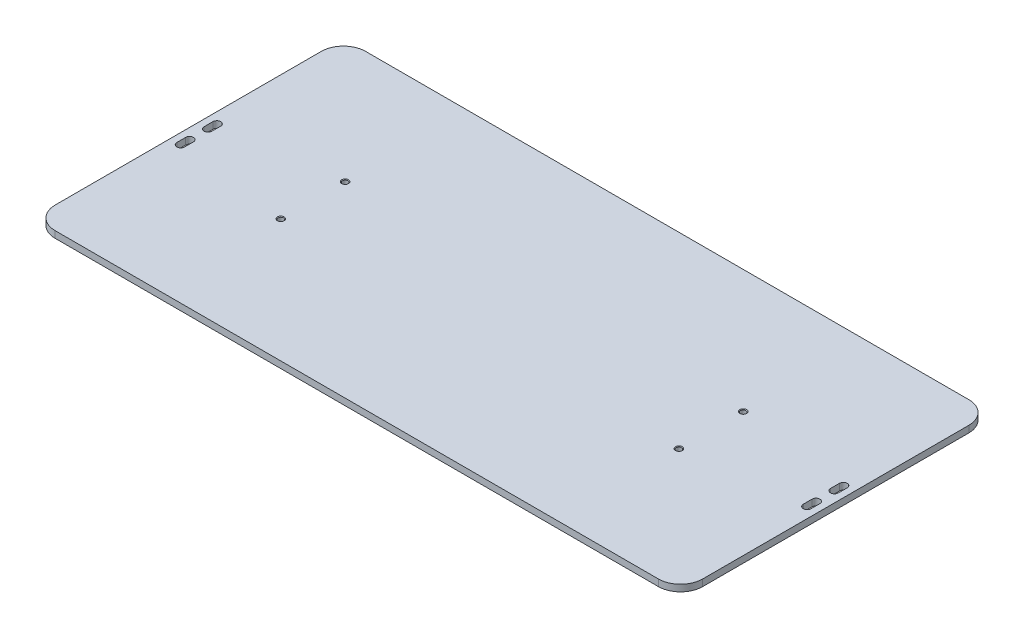
ISO-10303-21;
HEADER;
FILE_DESCRIPTION(('STEP AP214'),'2;1');
FILE_NAME('part.step','',(''),(''),'','','');
FILE_SCHEMA(('AUTOMOTIVE_DESIGN { 1 0 10303 214 1 1 1 1 }'));
ENDSEC;
DATA;
#1=APPLICATION_CONTEXT('core data for automotive mechanical design processes');
#2=APPLICATION_PROTOCOL_DEFINITION('international standard','automotive_design',2000,#1);
#3=PRODUCT_CONTEXT('',#1,'mechanical');
#4=PRODUCT('Part','Part','',(#3));
#5=PRODUCT_RELATED_PRODUCT_CATEGORY('part','',(#4));
#6=PRODUCT_DEFINITION_FORMATION('','',#4);
#7=PRODUCT_DEFINITION_CONTEXT('part definition',#1,'design');
#8=PRODUCT_DEFINITION('design','',#6,#7);
#9=PRODUCT_DEFINITION_SHAPE('','',#8);
#10=(LENGTH_UNIT() NAMED_UNIT(*) SI_UNIT(.MILLI.,.METRE.));
#11=(NAMED_UNIT(*) PLANE_ANGLE_UNIT() SI_UNIT($,.RADIAN.));
#12=(NAMED_UNIT(*) SI_UNIT($,.STERADIAN.) SOLID_ANGLE_UNIT());
#13=UNCERTAINTY_MEASURE_WITH_UNIT(LENGTH_MEASURE(1.E-05),#10,'distance_accuracy_value','');
#14=(GEOMETRIC_REPRESENTATION_CONTEXT(3) GLOBAL_UNCERTAINTY_ASSIGNED_CONTEXT((#13)) GLOBAL_UNIT_ASSIGNED_CONTEXT((#10,
#11,#12)) REPRESENTATION_CONTEXT('',''));
#15=CARTESIAN_POINT('',(0.,0.,0.));
#16=DIRECTION('',(0.,0.,1.));
#17=DIRECTION('',(1.,0.,0.));
#18=AXIS2_PLACEMENT_3D('',#15,#16,#17);
#19=CARTESIAN_POINT('',(0.,3.,0.));
#20=DIRECTION('',(0.,-1.,0.));
#21=DIRECTION('',(0.,0.,-1.));
#22=AXIS2_PLACEMENT_3D('',#19,#20,#21);
#23=PLANE('',#22);
#24=CARTESIAN_POINT('',(-89.7500000000001,3.,14.5));
#25=DIRECTION('',(0.,1.,0.));
#26=DIRECTION('',(0.,0.,1.));
#27=AXIS2_PLACEMENT_3D('',#24,#25,#26);
#28=CIRCLE('',#27,1.525);
#29=CARTESIAN_POINT('',(-89.7500000000001,3.,16.025));
#30=VERTEX_POINT('',#29);
#31=EDGE_CURVE('E839',#30,#30,#28,.T.);
#32=ORIENTED_EDGE('',*,*,#31,.F.);
#33=EDGE_LOOP('',(#32));
#34=FACE_BOUND('',#33,.T.);
#35=CARTESIAN_POINT('',(89.7500000000001,3.,14.5));
#36=DIRECTION('',(0.,1.,0.));
#37=DIRECTION('',(0.,0.,1.));
#38=AXIS2_PLACEMENT_3D('',#35,#36,#37);
#39=CIRCLE('',#38,1.525);
#40=CARTESIAN_POINT('',(89.7500000000001,3.,16.025));
#41=VERTEX_POINT('',#40);
#42=EDGE_CURVE('E830',#41,#41,#39,.T.);
#43=ORIENTED_EDGE('',*,*,#42,.F.);
#44=EDGE_LOOP('',(#43));
#45=FACE_BOUND('',#44,.T.);
#46=CARTESIAN_POINT('',(-89.7500000000001,3.,-14.5));
#47=DIRECTION('',(0.,1.,0.));
#48=DIRECTION('',(0.,0.,1.));
#49=AXIS2_PLACEMENT_3D('',#46,#47,#48);
#50=CIRCLE('',#49,1.525);
#51=CARTESIAN_POINT('',(-89.7500000000001,3.,-12.975));
#52=VERTEX_POINT('',#51);
#53=EDGE_CURVE('E810',#52,#52,#50,.T.);
#54=ORIENTED_EDGE('',*,*,#53,.F.);
#55=EDGE_LOOP('',(#54));
#56=FACE_BOUND('',#55,.T.);
#57=CARTESIAN_POINT('',(141.24,3.,-8.14));
#58=DIRECTION('',(0.,1.,0.));
#59=DIRECTION('',(0.,0.,-1.));
#60=AXIS2_PLACEMENT_3D('',#57,#58,#59);
#61=CIRCLE('',#60,1.76000000000001);
#62=CARTESIAN_POINT('',(143.,3.,-8.14));
#63=VERTEX_POINT('',#62);
#64=CARTESIAN_POINT('',(139.48,3.,-8.14));
#65=VERTEX_POINT('',#64);
#66=EDGE_CURVE('E247',#63,#65,#61,.T.);
#67=ORIENTED_EDGE('',*,*,#66,.F.);
#68=DIRECTION('',(0.,0.,-1.));
#69=VECTOR('',#68,1.);
#70=CARTESIAN_POINT('',(143.,3.,-8.14));
#71=LINE('',#70,#69);
#72=CARTESIAN_POINT('',(143.,3.,-4.16));
#73=VERTEX_POINT('',#72);
#74=EDGE_CURVE('E255',#73,#63,#71,.T.);
#75=ORIENTED_EDGE('',*,*,#74,.F.);
#76=CARTESIAN_POINT('',(141.24,3.,-4.16));
#77=DIRECTION('',(0.,1.,0.));
#78=DIRECTION('',(0.,0.,-1.));
#79=AXIS2_PLACEMENT_3D('',#76,#77,#78);
#80=CIRCLE('',#79,1.76000000000001);
#81=CARTESIAN_POINT('',(139.48,3.,-4.16));
#82=VERTEX_POINT('',#81);
#83=EDGE_CURVE('E252',#82,#73,#80,.T.);
#84=ORIENTED_EDGE('',*,*,#83,.F.);
#85=DIRECTION('',(0.,0.,1.));
#86=VECTOR('',#85,1.);
#87=CARTESIAN_POINT('',(139.48,3.,-8.14));
#88=LINE('',#87,#86);
#89=EDGE_CURVE('E249',#65,#82,#88,.T.);
#90=ORIENTED_EDGE('',*,*,#89,.F.);
#91=EDGE_LOOP('',(#67,#75,#84,#90));
#92=FACE_BOUND('',#91,.T.);
#93=CARTESIAN_POINT('',(-141.24,3.,-8.14));
#94=DIRECTION('',(0.,1.,0.));
#95=DIRECTION('',(0.,0.,1.));
#96=AXIS2_PLACEMENT_3D('',#93,#94,#95);
#97=CIRCLE('',#96,1.76000000000001);
#98=CARTESIAN_POINT('',(-139.48,3.,-8.14));
#99=VERTEX_POINT('',#98);
#100=CARTESIAN_POINT('',(-143.,3.,-8.14));
#101=VERTEX_POINT('',#100);
#102=EDGE_CURVE('E309',#99,#101,#97,.T.);
#103=ORIENTED_EDGE('',*,*,#102,.F.);
#104=DIRECTION('',(0.,0.,-1.));
#105=VECTOR('',#104,1.);
#106=CARTESIAN_POINT('',(-139.48,3.,-8.14));
#107=LINE('',#106,#105);
#108=CARTESIAN_POINT('',(-139.48,3.,-4.16));
#109=VERTEX_POINT('',#108);
#110=EDGE_CURVE('E317',#109,#99,#107,.T.);
#111=ORIENTED_EDGE('',*,*,#110,.F.);
#112=CARTESIAN_POINT('',(-141.24,3.,-4.16));
#113=DIRECTION('',(0.,1.,0.));
#114=DIRECTION('',(0.,0.,1.));
#115=AXIS2_PLACEMENT_3D('',#112,#113,#114);
#116=CIRCLE('',#115,1.76000000000001);
#117=CARTESIAN_POINT('',(-143.,3.,-4.16));
#118=VERTEX_POINT('',#117);
#119=EDGE_CURVE('E314',#118,#109,#116,.T.);
#120=ORIENTED_EDGE('',*,*,#119,.F.);
#121=DIRECTION('',(0.,0.,1.));
#122=VECTOR('',#121,1.);
#123=CARTESIAN_POINT('',(-143.,3.,-8.14));
#124=LINE('',#123,#122);
#125=EDGE_CURVE('E311',#101,#118,#124,.T.);
#126=ORIENTED_EDGE('',*,*,#125,.F.);
#127=EDGE_LOOP('',(#103,#111,#120,#126));
#128=FACE_BOUND('',#127,.T.);
#129=DIRECTION('',(1.,0.,0.));
#130=VECTOR('',#129,1.);
#131=CARTESIAN_POINT('',(-146.,3.,70.));
#132=LINE('',#131,#130);
#133=CARTESIAN_POINT('',(-136.,3.,70.));
#134=VERTEX_POINT('',#133);
#135=CARTESIAN_POINT('',(136.,3.,70.));
#136=VERTEX_POINT('',#135);
#137=EDGE_CURVE('E348',#134,#136,#132,.T.);
#138=ORIENTED_EDGE('',*,*,#137,.T.);
#139=CARTESIAN_POINT('',(136.,3.,60.));
#140=DIRECTION('',(0.,-1.,0.));
#141=DIRECTION('',(0.,0.,-1.));
#142=AXIS2_PLACEMENT_3D('',#139,#140,#141);
#143=CIRCLE('',#142,10.);
#144=CARTESIAN_POINT('',(146.,3.,60.));
#145=VERTEX_POINT('',#144);
#146=EDGE_CURVE('E383',#136,#145,#143,.F.);
#147=ORIENTED_EDGE('',*,*,#146,.T.);
#148=DIRECTION('',(0.,0.,-1.));
#149=VECTOR('',#148,1.);
#150=CARTESIAN_POINT('',(146.,3.,70.));
#151=LINE('',#150,#149);
#152=CARTESIAN_POINT('',(146.,3.,-60.));
#153=VERTEX_POINT('',#152);
#154=EDGE_CURVE('E340',#145,#153,#151,.T.);
#155=ORIENTED_EDGE('',*,*,#154,.T.);
#156=CARTESIAN_POINT('',(136.,3.,-60.));
#157=DIRECTION('',(0.,-1.,0.));
#158=DIRECTION('',(0.,0.,-1.));
#159=AXIS2_PLACEMENT_3D('',#156,#157,#158);
#160=CIRCLE('',#159,10.);
#161=CARTESIAN_POINT('',(136.,3.,-70.));
#162=VERTEX_POINT('',#161);
#163=EDGE_CURVE('E379',#153,#162,#160,.F.);
#164=ORIENTED_EDGE('',*,*,#163,.T.);
#165=DIRECTION('',(-1.,0.,0.));
#166=VECTOR('',#165,1.);
#167=CARTESIAN_POINT('',(-146.,3.,-70.));
#168=LINE('',#167,#166);
#169=CARTESIAN_POINT('',(-136.,3.,-70.));
#170=VERTEX_POINT('',#169);
#171=EDGE_CURVE('E343',#162,#170,#168,.T.);
#172=ORIENTED_EDGE('',*,*,#171,.T.);
#173=CARTESIAN_POINT('',(-136.,3.,-60.));
#174=DIRECTION('',(0.,-1.,0.));
#175=DIRECTION('',(0.,0.,-1.));
#176=AXIS2_PLACEMENT_3D('',#173,#174,#175);
#177=CIRCLE('',#176,10.);
#178=CARTESIAN_POINT('',(-146.,3.,-60.));
#179=VERTEX_POINT('',#178);
#180=EDGE_CURVE('E61',#170,#179,#177,.F.);
#181=ORIENTED_EDGE('',*,*,#180,.T.);
#182=DIRECTION('',(0.,0.,1.));
#183=VECTOR('',#182,1.);
#184=CARTESIAN_POINT('',(-146.,3.,70.));
#185=LINE('',#184,#183);
#186=CARTESIAN_POINT('',(-146.,3.,60.));
#187=VERTEX_POINT('',#186);
#188=EDGE_CURVE('E346',#179,#187,#185,.T.);
#189=ORIENTED_EDGE('',*,*,#188,.T.);
#190=CARTESIAN_POINT('',(-136.,3.,60.));
#191=DIRECTION('',(0.,-1.,0.));
#192=DIRECTION('',(0.,0.,-1.));
#193=AXIS2_PLACEMENT_3D('',#190,#191,#192);
#194=CIRCLE('',#193,10.);
#195=EDGE_CURVE('E381',#187,#134,#194,.F.);
#196=ORIENTED_EDGE('',*,*,#195,.T.);
#197=EDGE_LOOP('',(#138,#147,#155,#164,#172,#181,#189,#196));
#198=FACE_BOUND('',#197,.T.);
#199=CARTESIAN_POINT('',(-141.24,3.,8.14));
#200=DIRECTION('',(0.,1.,0.));
#201=DIRECTION('',(0.,0.,-1.));
#202=AXIS2_PLACEMENT_3D('',#199,#200,#201);
#203=CIRCLE('',#202,1.76000000000001);
#204=CARTESIAN_POINT('',(-143.,3.,8.14));
#205=VERTEX_POINT('',#204);
#206=CARTESIAN_POINT('',(-139.48,3.,8.14));
#207=VERTEX_POINT('',#206);
#208=EDGE_CURVE('E278',#205,#207,#203,.T.);
#209=ORIENTED_EDGE('',*,*,#208,.F.);
#210=DIRECTION('',(0.,0.,1.));
#211=VECTOR('',#210,1.);
#212=CARTESIAN_POINT('',(-143.,3.,8.14));
#213=LINE('',#212,#211);
#214=CARTESIAN_POINT('',(-143.,3.,4.16));
#215=VERTEX_POINT('',#214);
#216=EDGE_CURVE('E286',#215,#205,#213,.T.);
#217=ORIENTED_EDGE('',*,*,#216,.F.);
#218=CARTESIAN_POINT('',(-141.24,3.,4.16));
#219=DIRECTION('',(0.,1.,0.));
#220=DIRECTION('',(0.,0.,-1.));
#221=AXIS2_PLACEMENT_3D('',#218,#219,#220);
#222=CIRCLE('',#221,1.76000000000001);
#223=CARTESIAN_POINT('',(-139.48,3.,4.16));
#224=VERTEX_POINT('',#223);
#225=EDGE_CURVE('E283',#224,#215,#222,.T.);
#226=ORIENTED_EDGE('',*,*,#225,.F.);
#227=DIRECTION('',(0.,0.,-1.));
#228=VECTOR('',#227,1.);
#229=CARTESIAN_POINT('',(-139.48,3.,8.14));
#230=LINE('',#229,#228);
#231=EDGE_CURVE('E280',#207,#224,#230,.T.);
#232=ORIENTED_EDGE('',*,*,#231,.F.);
#233=EDGE_LOOP('',(#209,#217,#226,#232));
#234=FACE_BOUND('',#233,.T.);
#235=CARTESIAN_POINT('',(141.24,3.,8.14));
#236=DIRECTION('',(0.,1.,0.));
#237=DIRECTION('',(0.,0.,1.));
#238=AXIS2_PLACEMENT_3D('',#235,#236,#237);
#239=CIRCLE('',#238,1.76000000000001);
#240=CARTESIAN_POINT('',(139.48,3.,8.14));
#241=VERTEX_POINT('',#240);
#242=CARTESIAN_POINT('',(143.,3.,8.14));
#243=VERTEX_POINT('',#242);
#244=EDGE_CURVE('E203',#241,#243,#239,.T.);
#245=ORIENTED_EDGE('',*,*,#244,.F.);
#246=DIRECTION('',(0.,0.,1.));
#247=VECTOR('',#246,1.);
#248=CARTESIAN_POINT('',(139.48,3.,8.14));
#249=LINE('',#248,#247);
#250=CARTESIAN_POINT('',(139.48,3.,4.16));
#251=VERTEX_POINT('',#250);
#252=EDGE_CURVE('E229',#251,#241,#249,.T.);
#253=ORIENTED_EDGE('',*,*,#252,.F.);
#254=CARTESIAN_POINT('',(141.24,3.,4.16));
#255=DIRECTION('',(0.,1.,0.));
#256=DIRECTION('',(0.,0.,1.));
#257=AXIS2_PLACEMENT_3D('',#254,#255,#256);
#258=CIRCLE('',#257,1.76000000000001);
#259=CARTESIAN_POINT('',(143.,3.,4.16));
#260=VERTEX_POINT('',#259);
#261=EDGE_CURVE('E227',#260,#251,#258,.T.);
#262=ORIENTED_EDGE('',*,*,#261,.F.);
#263=DIRECTION('',(0.,0.,-1.));
#264=VECTOR('',#263,1.);
#265=CARTESIAN_POINT('',(143.,3.,8.14));
#266=LINE('',#265,#264);
#267=EDGE_CURVE('E213',#243,#260,#266,.T.);
#268=ORIENTED_EDGE('',*,*,#267,.F.);
#269=EDGE_LOOP('',(#245,#253,#262,#268));
#270=FACE_BOUND('',#269,.T.);
#271=CARTESIAN_POINT('',(89.7500000000001,3.,-14.5));
#272=DIRECTION('',(0.,1.,0.));
#273=DIRECTION('',(0.,0.,1.));
#274=AXIS2_PLACEMENT_3D('',#271,#272,#273);
#275=CIRCLE('',#274,1.525);
#276=CARTESIAN_POINT('',(89.7500000000001,3.,-12.975));
#277=VERTEX_POINT('',#276);
#278=EDGE_CURVE('E821',#277,#277,#275,.T.);
#279=ORIENTED_EDGE('',*,*,#278,.F.);
#280=EDGE_LOOP('',(#279));
#281=FACE_BOUND('',#280,.T.);
#282=ADVANCED_FACE('F39',(#34,#45,#56,#92,#128,#198,#234,#270,#281),#23,.F.);
#283=CARTESIAN_POINT('',(0.,0.,0.));
#284=DIRECTION('',(0.,-1.,0.));
#285=DIRECTION('',(0.,0.,-1.));
#286=AXIS2_PLACEMENT_3D('',#283,#284,#285);
#287=PLANE('',#286);
#288=CARTESIAN_POINT('',(-89.7500000000001,0.,14.5));
#289=DIRECTION('',(0.,1.,0.));
#290=DIRECTION('',(0.,0.,1.));
#291=AXIS2_PLACEMENT_3D('',#288,#289,#290);
#292=CIRCLE('',#291,1.25);
#293=CARTESIAN_POINT('',(-89.7500000000001,0.,15.75));
#294=VERTEX_POINT('',#293);
#295=EDGE_CURVE('E833',#294,#294,#292,.T.);
#296=ORIENTED_EDGE('',*,*,#295,.T.);
#297=EDGE_LOOP('',(#296));
#298=FACE_BOUND('',#297,.T.);
#299=CARTESIAN_POINT('',(89.7500000000001,0.,14.5));
#300=DIRECTION('',(0.,1.,0.));
#301=DIRECTION('',(0.,0.,1.));
#302=AXIS2_PLACEMENT_3D('',#299,#300,#301);
#303=CIRCLE('',#302,1.25);
#304=CARTESIAN_POINT('',(89.7500000000001,0.,15.75));
#305=VERTEX_POINT('',#304);
#306=EDGE_CURVE('E824',#305,#305,#303,.T.);
#307=ORIENTED_EDGE('',*,*,#306,.T.);
#308=EDGE_LOOP('',(#307));
#309=FACE_BOUND('',#308,.T.);
#310=CARTESIAN_POINT('',(89.7500000000001,0.,-14.5));
#311=DIRECTION('',(0.,1.,0.));
#312=DIRECTION('',(0.,0.,1.));
#313=AXIS2_PLACEMENT_3D('',#310,#311,#312);
#314=CIRCLE('',#313,1.25);
#315=CARTESIAN_POINT('',(89.7500000000001,0.,-13.25));
#316=VERTEX_POINT('',#315);
#317=EDGE_CURVE('E813',#316,#316,#314,.T.);
#318=ORIENTED_EDGE('',*,*,#317,.T.);
#319=EDGE_LOOP('',(#318));
#320=FACE_BOUND('',#319,.T.);
#321=DIRECTION('',(0.,0.,1.));
#322=VECTOR('',#321,1.);
#323=CARTESIAN_POINT('',(139.48,0.,8.14));
#324=LINE('',#323,#322);
#325=CARTESIAN_POINT('',(139.48,0.,4.16));
#326=VERTEX_POINT('',#325);
#327=CARTESIAN_POINT('',(139.48,0.,8.14));
#328=VERTEX_POINT('',#327);
#329=EDGE_CURVE('E214',#326,#328,#324,.T.);
#330=ORIENTED_EDGE('',*,*,#329,.T.);
#331=CARTESIAN_POINT('',(141.24,0.,8.14));
#332=DIRECTION('',(0.,1.,0.));
#333=DIRECTION('',(0.,0.,1.));
#334=AXIS2_PLACEMENT_3D('',#331,#332,#333);
#335=CIRCLE('',#334,1.76000000000001);
#336=CARTESIAN_POINT('',(143.,0.,8.14));
#337=VERTEX_POINT('',#336);
#338=EDGE_CURVE('E234',#328,#337,#335,.T.);
#339=ORIENTED_EDGE('',*,*,#338,.T.);
#340=DIRECTION('',(0.,0.,-1.));
#341=VECTOR('',#340,1.);
#342=CARTESIAN_POINT('',(143.,0.,8.14));
#343=LINE('',#342,#341);
#344=CARTESIAN_POINT('',(143.,0.,4.16));
#345=VERTEX_POINT('',#344);
#346=EDGE_CURVE('E220',#337,#345,#343,.T.);
#347=ORIENTED_EDGE('',*,*,#346,.T.);
#348=CARTESIAN_POINT('',(141.24,0.,4.16));
#349=DIRECTION('',(0.,1.,0.));
#350=DIRECTION('',(0.,0.,1.));
#351=AXIS2_PLACEMENT_3D('',#348,#349,#350);
#352=CIRCLE('',#351,1.76000000000001);
#353=EDGE_CURVE('E238',#345,#326,#352,.T.);
#354=ORIENTED_EDGE('',*,*,#353,.T.);
#355=EDGE_LOOP('',(#330,#339,#347,#354));
#356=FACE_BOUND('',#355,.T.);
#357=DIRECTION('',(0.,0.,-1.));
#358=VECTOR('',#357,1.);
#359=CARTESIAN_POINT('',(143.,0.,-8.14));
#360=LINE('',#359,#358);
#361=CARTESIAN_POINT('',(143.,0.,-4.16));
#362=VERTEX_POINT('',#361);
#363=CARTESIAN_POINT('',(143.,0.,-8.14));
#364=VERTEX_POINT('',#363);
#365=EDGE_CURVE('E250',#362,#364,#360,.T.);
#366=ORIENTED_EDGE('',*,*,#365,.T.);
#367=CARTESIAN_POINT('',(141.24,0.,-8.14));
#368=DIRECTION('',(0.,1.,0.));
#369=DIRECTION('',(0.,0.,-1.));
#370=AXIS2_PLACEMENT_3D('',#367,#368,#369);
#371=CIRCLE('',#370,1.76000000000001);
#372=CARTESIAN_POINT('',(139.48,0.,-8.14));
#373=VERTEX_POINT('',#372);
#374=EDGE_CURVE('E221',#364,#373,#371,.T.);
#375=ORIENTED_EDGE('',*,*,#374,.T.);
#376=DIRECTION('',(0.,0.,1.));
#377=VECTOR('',#376,1.);
#378=CARTESIAN_POINT('',(139.48,0.,-8.14));
#379=LINE('',#378,#377);
#380=CARTESIAN_POINT('',(139.48,0.,-4.16));
#381=VERTEX_POINT('',#380);
#382=EDGE_CURVE('E260',#373,#381,#379,.T.);
#383=ORIENTED_EDGE('',*,*,#382,.T.);
#384=CARTESIAN_POINT('',(141.24,0.,-4.16));
#385=DIRECTION('',(0.,1.,0.));
#386=DIRECTION('',(0.,0.,-1.));
#387=AXIS2_PLACEMENT_3D('',#384,#385,#386);
#388=CIRCLE('',#387,1.76000000000001);
#389=EDGE_CURVE('E263',#381,#362,#388,.T.);
#390=ORIENTED_EDGE('',*,*,#389,.T.);
#391=EDGE_LOOP('',(#366,#375,#383,#390));
#392=FACE_BOUND('',#391,.T.);
#393=DIRECTION('',(0.,0.,1.));
#394=VECTOR('',#393,1.);
#395=CARTESIAN_POINT('',(-143.,0.,8.14));
#396=LINE('',#395,#394);
#397=CARTESIAN_POINT('',(-143.,0.,4.16));
#398=VERTEX_POINT('',#397);
#399=CARTESIAN_POINT('',(-143.,0.,8.14));
#400=VERTEX_POINT('',#399);
#401=EDGE_CURVE('E281',#398,#400,#396,.T.);
#402=ORIENTED_EDGE('',*,*,#401,.T.);
#403=CARTESIAN_POINT('',(-141.24,0.,8.14));
#404=DIRECTION('',(0.,1.,0.));
#405=DIRECTION('',(0.,0.,-1.));
#406=AXIS2_PLACEMENT_3D('',#403,#404,#405);
#407=CIRCLE('',#406,1.76000000000001);
#408=CARTESIAN_POINT('',(-139.48,0.,8.14));
#409=VERTEX_POINT('',#408);
#410=EDGE_CURVE('E277',#400,#409,#407,.T.);
#411=ORIENTED_EDGE('',*,*,#410,.T.);
#412=DIRECTION('',(0.,0.,-1.));
#413=VECTOR('',#412,1.);
#414=CARTESIAN_POINT('',(-139.48,0.,8.14));
#415=LINE('',#414,#413);
#416=CARTESIAN_POINT('',(-139.48,0.,4.16));
#417=VERTEX_POINT('',#416);
#418=EDGE_CURVE('E291',#409,#417,#415,.T.);
#419=ORIENTED_EDGE('',*,*,#418,.T.);
#420=CARTESIAN_POINT('',(-141.24,0.,4.16));
#421=DIRECTION('',(0.,1.,0.));
#422=DIRECTION('',(0.,0.,-1.));
#423=AXIS2_PLACEMENT_3D('',#420,#421,#422);
#424=CIRCLE('',#423,1.76000000000001);
#425=EDGE_CURVE('E294',#417,#398,#424,.T.);
#426=ORIENTED_EDGE('',*,*,#425,.T.);
#427=EDGE_LOOP('',(#402,#411,#419,#426));
#428=FACE_BOUND('',#427,.T.);
#429=DIRECTION('',(0.,0.,-1.));
#430=VECTOR('',#429,1.);
#431=CARTESIAN_POINT('',(-139.48,0.,-8.14));
#432=LINE('',#431,#430);
#433=CARTESIAN_POINT('',(-139.48,0.,-4.16));
#434=VERTEX_POINT('',#433);
#435=CARTESIAN_POINT('',(-139.48,0.,-8.14));
#436=VERTEX_POINT('',#435);
#437=EDGE_CURVE('E312',#434,#436,#432,.T.);
#438=ORIENTED_EDGE('',*,*,#437,.T.);
#439=CARTESIAN_POINT('',(-141.24,0.,-8.14));
#440=DIRECTION('',(0.,1.,0.));
#441=DIRECTION('',(0.,0.,1.));
#442=AXIS2_PLACEMENT_3D('',#439,#440,#441);
#443=CIRCLE('',#442,1.76000000000001);
#444=CARTESIAN_POINT('',(-143.,0.,-8.14));
#445=VERTEX_POINT('',#444);
#446=EDGE_CURVE('E308',#436,#445,#443,.T.);
#447=ORIENTED_EDGE('',*,*,#446,.T.);
#448=DIRECTION('',(0.,0.,1.));
#449=VECTOR('',#448,1.);
#450=CARTESIAN_POINT('',(-143.,0.,-8.14));
#451=LINE('',#450,#449);
#452=CARTESIAN_POINT('',(-143.,0.,-4.16));
#453=VERTEX_POINT('',#452);
#454=EDGE_CURVE('E322',#445,#453,#451,.T.);
#455=ORIENTED_EDGE('',*,*,#454,.T.);
#456=CARTESIAN_POINT('',(-141.24,0.,-4.16));
#457=DIRECTION('',(0.,1.,0.));
#458=DIRECTION('',(0.,0.,1.));
#459=AXIS2_PLACEMENT_3D('',#456,#457,#458);
#460=CIRCLE('',#459,1.76000000000001);
#461=EDGE_CURVE('E325',#453,#434,#460,.T.);
#462=ORIENTED_EDGE('',*,*,#461,.T.);
#463=EDGE_LOOP('',(#438,#447,#455,#462));
#464=FACE_BOUND('',#463,.T.);
#465=DIRECTION('',(0.,0.,-1.));
#466=VECTOR('',#465,1.);
#467=CARTESIAN_POINT('',(146.,0.,70.));
#468=LINE('',#467,#466);
#469=CARTESIAN_POINT('',(146.,0.,60.));
#470=VERTEX_POINT('',#469);
#471=CARTESIAN_POINT('',(146.,0.,-60.));
#472=VERTEX_POINT('',#471);
#473=EDGE_CURVE('E339',#470,#472,#468,.T.);
#474=ORIENTED_EDGE('',*,*,#473,.F.);
#475=CARTESIAN_POINT('',(136.,0.,60.));
#476=DIRECTION('',(0.,-1.,0.));
#477=DIRECTION('',(0.,0.,-1.));
#478=AXIS2_PLACEMENT_3D('',#475,#476,#477);
#479=CIRCLE('',#478,10.);
#480=CARTESIAN_POINT('',(136.,0.,70.));
#481=VERTEX_POINT('',#480);
#482=EDGE_CURVE('E371',#470,#481,#479,.T.);
#483=ORIENTED_EDGE('',*,*,#482,.T.);
#484=DIRECTION('',(1.,0.,0.));
#485=VECTOR('',#484,1.);
#486=CARTESIAN_POINT('',(-146.,0.,70.));
#487=LINE('',#486,#485);
#488=CARTESIAN_POINT('',(-136.,0.,70.));
#489=VERTEX_POINT('',#488);
#490=EDGE_CURVE('E344',#489,#481,#487,.T.);
#491=ORIENTED_EDGE('',*,*,#490,.F.);
#492=CARTESIAN_POINT('',(-136.,0.,60.));
#493=DIRECTION('',(0.,-1.,0.));
#494=DIRECTION('',(0.,0.,-1.));
#495=AXIS2_PLACEMENT_3D('',#492,#493,#494);
#496=CIRCLE('',#495,10.);
#497=CARTESIAN_POINT('',(-146.,0.,60.));
#498=VERTEX_POINT('',#497);
#499=EDGE_CURVE('E369',#489,#498,#496,.T.);
#500=ORIENTED_EDGE('',*,*,#499,.T.);
#501=DIRECTION('',(0.,0.,1.));
#502=VECTOR('',#501,1.);
#503=CARTESIAN_POINT('',(-146.,0.,70.));
#504=LINE('',#503,#502);
#505=CARTESIAN_POINT('',(-146.,0.,-60.));
#506=VERTEX_POINT('',#505);
#507=EDGE_CURVE('E357',#506,#498,#504,.T.);
#508=ORIENTED_EDGE('',*,*,#507,.F.);
#509=CARTESIAN_POINT('',(-136.,0.,-60.));
#510=DIRECTION('',(0.,-1.,0.));
#511=DIRECTION('',(0.,0.,-1.));
#512=AXIS2_PLACEMENT_3D('',#509,#510,#511);
#513=CIRCLE('',#512,10.);
#514=CARTESIAN_POINT('',(-136.,0.,-70.));
#515=VERTEX_POINT('',#514);
#516=EDGE_CURVE('E365',#506,#515,#513,.T.);
#517=ORIENTED_EDGE('',*,*,#516,.T.);
#518=DIRECTION('',(-1.,0.,0.));
#519=VECTOR('',#518,1.);
#520=CARTESIAN_POINT('',(-146.,0.,-70.));
#521=LINE('',#520,#519);
#522=CARTESIAN_POINT('',(136.,0.,-70.));
#523=VERTEX_POINT('',#522);
#524=EDGE_CURVE('E354',#523,#515,#521,.T.);
#525=ORIENTED_EDGE('',*,*,#524,.F.);
#526=CARTESIAN_POINT('',(136.,0.,-60.));
#527=DIRECTION('',(0.,-1.,0.));
#528=DIRECTION('',(0.,0.,-1.));
#529=AXIS2_PLACEMENT_3D('',#526,#527,#528);
#530=CIRCLE('',#529,10.);
#531=EDGE_CURVE('E367',#523,#472,#530,.T.);
#532=ORIENTED_EDGE('',*,*,#531,.T.);
#533=EDGE_LOOP('',(#474,#483,#491,#500,#508,#517,#525,#532));
#534=FACE_BOUND('',#533,.T.);
#535=CARTESIAN_POINT('',(-89.7500000000001,0.,-14.5));
#536=DIRECTION('',(0.,1.,0.));
#537=DIRECTION('',(0.,0.,1.));
#538=AXIS2_PLACEMENT_3D('',#535,#536,#537);
#539=CIRCLE('',#538,1.25);
#540=CARTESIAN_POINT('',(-89.7500000000001,0.,-13.25));
#541=VERTEX_POINT('',#540);
#542=EDGE_CURVE('E236',#541,#541,#539,.T.);
#543=ORIENTED_EDGE('',*,*,#542,.T.);
#544=EDGE_LOOP('',(#543));
#545=FACE_BOUND('',#544,.T.);
#546=ADVANCED_FACE('F402',(#298,#309,#320,#356,#392,#428,#464,#534,#545),#287,.T.);
#547=CARTESIAN_POINT('',(146.,3.,70.));
#548=DIRECTION('',(-1.,0.,0.));
#549=DIRECTION('',(0.,0.,1.));
#550=AXIS2_PLACEMENT_3D('',#547,#548,#549);
#551=PLANE('',#550);
#552=ORIENTED_EDGE('',*,*,#154,.F.);
#553=DIRECTION('',(0.,-1.,0.));
#554=VECTOR('',#553,1.);
#555=CARTESIAN_POINT('',(146.,3.,60.));
#556=LINE('',#555,#554);
#557=EDGE_CURVE('E362',#145,#470,#556,.T.);
#558=ORIENTED_EDGE('',*,*,#557,.T.);
#559=ORIENTED_EDGE('',*,*,#473,.T.);
#560=DIRECTION('',(0.,-1.,0.));
#561=VECTOR('',#560,1.);
#562=CARTESIAN_POINT('',(146.,3.,-60.));
#563=LINE('',#562,#561);
#564=EDGE_CURVE('E351',#472,#153,#563,.F.);
#565=ORIENTED_EDGE('',*,*,#564,.T.);
#566=EDGE_LOOP('',(#552,#558,#559,#565));
#567=FACE_BOUND('',#566,.T.);
#568=ADVANCED_FACE('F419',(#567),#551,.F.);
#569=CARTESIAN_POINT('',(-146.,3.,-70.));
#570=DIRECTION('',(0.,0.,1.));
#571=DIRECTION('',(1.,0.,0.));
#572=AXIS2_PLACEMENT_3D('',#569,#570,#571);
#573=PLANE('',#572);
#574=ORIENTED_EDGE('',*,*,#171,.F.);
#575=DIRECTION('',(0.,-1.,0.));
#576=VECTOR('',#575,1.);
#577=CARTESIAN_POINT('',(136.,3.,-70.));
#578=LINE('',#577,#576);
#579=EDGE_CURVE('E11',#162,#523,#578,.T.);
#580=ORIENTED_EDGE('',*,*,#579,.T.);
#581=ORIENTED_EDGE('',*,*,#524,.T.);
#582=DIRECTION('',(0.,-1.,0.));
#583=VECTOR('',#582,1.);
#584=CARTESIAN_POINT('',(-136.,3.,-70.));
#585=LINE('',#584,#583);
#586=EDGE_CURVE('E47',#515,#170,#585,.F.);
#587=ORIENTED_EDGE('',*,*,#586,.T.);
#588=EDGE_LOOP('',(#574,#580,#581,#587));
#589=FACE_BOUND('',#588,.T.);
#590=ADVANCED_FACE('F391',(#589),#573,.F.);
#591=CARTESIAN_POINT('',(-146.,3.,70.));
#592=DIRECTION('',(1.,0.,0.));
#593=DIRECTION('',(0.,0.,-1.));
#594=AXIS2_PLACEMENT_3D('',#591,#592,#593);
#595=PLANE('',#594);
#596=ORIENTED_EDGE('',*,*,#507,.T.);
#597=DIRECTION('',(0.,-1.,0.));
#598=VECTOR('',#597,1.);
#599=CARTESIAN_POINT('',(-146.,3.,60.));
#600=LINE('',#599,#598);
#601=EDGE_CURVE('E54',#498,#187,#600,.F.);
#602=ORIENTED_EDGE('',*,*,#601,.T.);
#603=ORIENTED_EDGE('',*,*,#188,.F.);
#604=DIRECTION('',(0.,-1.,0.));
#605=VECTOR('',#604,1.);
#606=CARTESIAN_POINT('',(-146.,3.,-60.));
#607=LINE('',#606,#605);
#608=EDGE_CURVE('E385',#179,#506,#607,.T.);
#609=ORIENTED_EDGE('',*,*,#608,.T.);
#610=EDGE_LOOP('',(#596,#602,#603,#609));
#611=FACE_BOUND('',#610,.T.);
#612=ADVANCED_FACE('F399',(#611),#595,.F.);
#613=CARTESIAN_POINT('',(-146.,3.,70.));
#614=DIRECTION('',(0.,0.,-1.));
#615=DIRECTION('',(-1.,0.,0.));
#616=AXIS2_PLACEMENT_3D('',#613,#614,#615);
#617=PLANE('',#616);
#618=ORIENTED_EDGE('',*,*,#490,.T.);
#619=DIRECTION('',(0.,-1.,0.));
#620=VECTOR('',#619,1.);
#621=CARTESIAN_POINT('',(136.,3.,70.));
#622=LINE('',#621,#620);
#623=EDGE_CURVE('E376',#481,#136,#622,.F.);
#624=ORIENTED_EDGE('',*,*,#623,.T.);
#625=ORIENTED_EDGE('',*,*,#137,.F.);
#626=DIRECTION('',(0.,-1.,0.));
#627=VECTOR('',#626,1.);
#628=CARTESIAN_POINT('',(-136.,3.,70.));
#629=LINE('',#628,#627);
#630=EDGE_CURVE('E373',#134,#489,#629,.T.);
#631=ORIENTED_EDGE('',*,*,#630,.T.);
#632=EDGE_LOOP('',(#618,#624,#625,#631));
#633=FACE_BOUND('',#632,.T.);
#634=ADVANCED_FACE('F411',(#633),#617,.F.);
#635=CARTESIAN_POINT('',(-141.24,3.,-8.14));
#636=DIRECTION('',(0.,-1.,0.));
#637=DIRECTION('',(0.,0.,-1.));
#638=AXIS2_PLACEMENT_3D('',#635,#636,#637);
#639=CYLINDRICAL_SURFACE('',#638,1.76000000000001);
#640=ORIENTED_EDGE('',*,*,#446,.F.);
#641=DIRECTION('',(0.,-1.,0.));
#642=VECTOR('',#641,1.);
#643=CARTESIAN_POINT('',(-139.48,3.,-8.14));
#644=LINE('',#643,#642);
#645=EDGE_CURVE('E319',#99,#436,#644,.T.);
#646=ORIENTED_EDGE('',*,*,#645,.F.);
#647=ORIENTED_EDGE('',*,*,#102,.T.);
#648=DIRECTION('',(0.,-1.,0.));
#649=VECTOR('',#648,1.);
#650=CARTESIAN_POINT('',(-143.,3.,-8.14));
#651=LINE('',#650,#649);
#652=EDGE_CURVE('E336',#101,#445,#651,.T.);
#653=ORIENTED_EDGE('',*,*,#652,.T.);
#654=EDGE_LOOP('',(#640,#646,#647,#653));
#655=FACE_BOUND('',#654,.T.);
#656=ADVANCED_FACE('F440',(#655),#639,.F.);
#657=CARTESIAN_POINT('',(-143.,3.,-8.14));
#658=DIRECTION('',(1.,0.,0.));
#659=DIRECTION('',(0.,0.,-1.));
#660=AXIS2_PLACEMENT_3D('',#657,#658,#659);
#661=PLANE('',#660);
#662=ORIENTED_EDGE('',*,*,#454,.F.);
#663=ORIENTED_EDGE('',*,*,#652,.F.);
#664=ORIENTED_EDGE('',*,*,#125,.T.);
#665=DIRECTION('',(0.,-1.,0.));
#666=VECTOR('',#665,1.);
#667=CARTESIAN_POINT('',(-143.,3.,-4.16));
#668=LINE('',#667,#666);
#669=EDGE_CURVE('E334',#118,#453,#668,.T.);
#670=ORIENTED_EDGE('',*,*,#669,.T.);
#671=EDGE_LOOP('',(#662,#663,#664,#670));
#672=FACE_BOUND('',#671,.T.);
#673=ADVANCED_FACE('F541',(#672),#661,.T.);
#674=CARTESIAN_POINT('',(-141.24,3.,-4.16));
#675=DIRECTION('',(0.,-1.,0.));
#676=DIRECTION('',(0.,0.,-1.));
#677=AXIS2_PLACEMENT_3D('',#674,#675,#676);
#678=CYLINDRICAL_SURFACE('',#677,1.76000000000001);
#679=ORIENTED_EDGE('',*,*,#461,.F.);
#680=ORIENTED_EDGE('',*,*,#669,.F.);
#681=ORIENTED_EDGE('',*,*,#119,.T.);
#682=DIRECTION('',(0.,-1.,0.));
#683=VECTOR('',#682,1.);
#684=CARTESIAN_POINT('',(-139.48,3.,-4.16));
#685=LINE('',#684,#683);
#686=EDGE_CURVE('E332',#109,#434,#685,.T.);
#687=ORIENTED_EDGE('',*,*,#686,.T.);
#688=EDGE_LOOP('',(#679,#680,#681,#687));
#689=FACE_BOUND('',#688,.T.);
#690=ADVANCED_FACE('F538',(#689),#678,.F.);
#691=CARTESIAN_POINT('',(-139.48,3.,-8.14));
#692=DIRECTION('',(-1.,0.,0.));
#693=DIRECTION('',(0.,0.,1.));
#694=AXIS2_PLACEMENT_3D('',#691,#692,#693);
#695=PLANE('',#694);
#696=ORIENTED_EDGE('',*,*,#437,.F.);
#697=ORIENTED_EDGE('',*,*,#686,.F.);
#698=ORIENTED_EDGE('',*,*,#110,.T.);
#699=ORIENTED_EDGE('',*,*,#645,.T.);
#700=EDGE_LOOP('',(#696,#697,#698,#699));
#701=FACE_BOUND('',#700,.T.);
#702=ADVANCED_FACE('F534',(#701),#695,.T.);
#703=CARTESIAN_POINT('',(-141.24,3.,8.14));
#704=DIRECTION('',(0.,-1.,0.));
#705=DIRECTION('',(0.,0.,-1.));
#706=AXIS2_PLACEMENT_3D('',#703,#704,#705);
#707=CYLINDRICAL_SURFACE('',#706,1.76000000000001);
#708=ORIENTED_EDGE('',*,*,#410,.F.);
#709=DIRECTION('',(0.,-1.,0.));
#710=VECTOR('',#709,1.);
#711=CARTESIAN_POINT('',(-143.,3.,8.14));
#712=LINE('',#711,#710);
#713=EDGE_CURVE('E288',#205,#400,#712,.T.);
#714=ORIENTED_EDGE('',*,*,#713,.F.);
#715=ORIENTED_EDGE('',*,*,#208,.T.);
#716=DIRECTION('',(0.,-1.,0.));
#717=VECTOR('',#716,1.);
#718=CARTESIAN_POINT('',(-139.48,3.,8.14));
#719=LINE('',#718,#717);
#720=EDGE_CURVE('E305',#207,#409,#719,.T.);
#721=ORIENTED_EDGE('',*,*,#720,.T.);
#722=EDGE_LOOP('',(#708,#714,#715,#721));
#723=FACE_BOUND('',#722,.T.);
#724=ADVANCED_FACE('F530',(#723),#707,.F.);
#725=CARTESIAN_POINT('',(-139.48,3.,8.14));
#726=DIRECTION('',(-1.,0.,0.));
#727=DIRECTION('',(0.,0.,1.));
#728=AXIS2_PLACEMENT_3D('',#725,#726,#727);
#729=PLANE('',#728);
#730=ORIENTED_EDGE('',*,*,#418,.F.);
#731=ORIENTED_EDGE('',*,*,#720,.F.);
#732=ORIENTED_EDGE('',*,*,#231,.T.);
#733=DIRECTION('',(0.,-1.,0.));
#734=VECTOR('',#733,1.);
#735=CARTESIAN_POINT('',(-139.48,3.,4.16));
#736=LINE('',#735,#734);
#737=EDGE_CURVE('E303',#224,#417,#736,.T.);
#738=ORIENTED_EDGE('',*,*,#737,.T.);
#739=EDGE_LOOP('',(#730,#731,#732,#738));
#740=FACE_BOUND('',#739,.T.);
#741=ADVANCED_FACE('F526',(#740),#729,.T.);
#742=CARTESIAN_POINT('',(-141.24,3.,4.16));
#743=DIRECTION('',(0.,-1.,0.));
#744=DIRECTION('',(0.,0.,-1.));
#745=AXIS2_PLACEMENT_3D('',#742,#743,#744);
#746=CYLINDRICAL_SURFACE('',#745,1.76000000000001);
#747=ORIENTED_EDGE('',*,*,#425,.F.);
#748=ORIENTED_EDGE('',*,*,#737,.F.);
#749=ORIENTED_EDGE('',*,*,#225,.T.);
#750=DIRECTION('',(0.,-1.,0.));
#751=VECTOR('',#750,1.);
#752=CARTESIAN_POINT('',(-143.,3.,4.16));
#753=LINE('',#752,#751);
#754=EDGE_CURVE('E301',#215,#398,#753,.T.);
#755=ORIENTED_EDGE('',*,*,#754,.T.);
#756=EDGE_LOOP('',(#747,#748,#749,#755));
#757=FACE_BOUND('',#756,.T.);
#758=ADVANCED_FACE('F522',(#757),#746,.F.);
#759=CARTESIAN_POINT('',(-143.,3.,8.14));
#760=DIRECTION('',(1.,0.,0.));
#761=DIRECTION('',(0.,0.,-1.));
#762=AXIS2_PLACEMENT_3D('',#759,#760,#761);
#763=PLANE('',#762);
#764=ORIENTED_EDGE('',*,*,#401,.F.);
#765=ORIENTED_EDGE('',*,*,#754,.F.);
#766=ORIENTED_EDGE('',*,*,#216,.T.);
#767=ORIENTED_EDGE('',*,*,#713,.T.);
#768=EDGE_LOOP('',(#764,#765,#766,#767));
#769=FACE_BOUND('',#768,.T.);
#770=ADVANCED_FACE('F518',(#769),#763,.T.);
#771=CARTESIAN_POINT('',(141.24,3.,-8.14));
#772=DIRECTION('',(0.,-1.,0.));
#773=DIRECTION('',(0.,0.,-1.));
#774=AXIS2_PLACEMENT_3D('',#771,#772,#773);
#775=CYLINDRICAL_SURFACE('',#774,1.76000000000001);
#776=ORIENTED_EDGE('',*,*,#374,.F.);
#777=DIRECTION('',(0.,-1.,0.));
#778=VECTOR('',#777,1.);
#779=CARTESIAN_POINT('',(143.,3.,-8.14));
#780=LINE('',#779,#778);
#781=EDGE_CURVE('E257',#63,#364,#780,.T.);
#782=ORIENTED_EDGE('',*,*,#781,.F.);
#783=ORIENTED_EDGE('',*,*,#66,.T.);
#784=DIRECTION('',(0.,-1.,0.));
#785=VECTOR('',#784,1.);
#786=CARTESIAN_POINT('',(139.48,3.,-8.14));
#787=LINE('',#786,#785);
#788=EDGE_CURVE('E274',#65,#373,#787,.T.);
#789=ORIENTED_EDGE('',*,*,#788,.T.);
#790=EDGE_LOOP('',(#776,#782,#783,#789));
#791=FACE_BOUND('',#790,.T.);
#792=ADVANCED_FACE('F514',(#791),#775,.F.);
#793=CARTESIAN_POINT('',(139.48,3.,-8.14));
#794=DIRECTION('',(1.,0.,0.));
#795=DIRECTION('',(0.,0.,-1.));
#796=AXIS2_PLACEMENT_3D('',#793,#794,#795);
#797=PLANE('',#796);
#798=ORIENTED_EDGE('',*,*,#382,.F.);
#799=ORIENTED_EDGE('',*,*,#788,.F.);
#800=ORIENTED_EDGE('',*,*,#89,.T.);
#801=DIRECTION('',(0.,-1.,0.));
#802=VECTOR('',#801,1.);
#803=CARTESIAN_POINT('',(139.48,3.,-4.16));
#804=LINE('',#803,#802);
#805=EDGE_CURVE('E272',#82,#381,#804,.T.);
#806=ORIENTED_EDGE('',*,*,#805,.T.);
#807=EDGE_LOOP('',(#798,#799,#800,#806));
#808=FACE_BOUND('',#807,.T.);
#809=ADVANCED_FACE('F510',(#808),#797,.T.);
#810=CARTESIAN_POINT('',(141.24,3.,-4.16));
#811=DIRECTION('',(0.,-1.,0.));
#812=DIRECTION('',(0.,0.,-1.));
#813=AXIS2_PLACEMENT_3D('',#810,#811,#812);
#814=CYLINDRICAL_SURFACE('',#813,1.76000000000001);
#815=ORIENTED_EDGE('',*,*,#389,.F.);
#816=ORIENTED_EDGE('',*,*,#805,.F.);
#817=ORIENTED_EDGE('',*,*,#83,.T.);
#818=DIRECTION('',(0.,-1.,0.));
#819=VECTOR('',#818,1.);
#820=CARTESIAN_POINT('',(143.,3.,-4.16));
#821=LINE('',#820,#819);
#822=EDGE_CURVE('E270',#73,#362,#821,.T.);
#823=ORIENTED_EDGE('',*,*,#822,.T.);
#824=EDGE_LOOP('',(#815,#816,#817,#823));
#825=FACE_BOUND('',#824,.T.);
#826=ADVANCED_FACE('F506',(#825),#814,.F.);
#827=CARTESIAN_POINT('',(143.,3.,-8.14));
#828=DIRECTION('',(-1.,0.,0.));
#829=DIRECTION('',(0.,0.,1.));
#830=AXIS2_PLACEMENT_3D('',#827,#828,#829);
#831=PLANE('',#830);
#832=ORIENTED_EDGE('',*,*,#365,.F.);
#833=ORIENTED_EDGE('',*,*,#822,.F.);
#834=ORIENTED_EDGE('',*,*,#74,.T.);
#835=ORIENTED_EDGE('',*,*,#781,.T.);
#836=EDGE_LOOP('',(#832,#833,#834,#835));
#837=FACE_BOUND('',#836,.T.);
#838=ADVANCED_FACE('F503',(#837),#831,.T.);
#839=CARTESIAN_POINT('',(141.24,3.,8.14));
#840=DIRECTION('',(0.,-1.,0.));
#841=DIRECTION('',(0.,0.,-1.));
#842=AXIS2_PLACEMENT_3D('',#839,#840,#841);
#843=CYLINDRICAL_SURFACE('',#842,1.76000000000001);
#844=ORIENTED_EDGE('',*,*,#338,.F.);
#845=DIRECTION('',(0.,-1.,0.));
#846=VECTOR('',#845,1.);
#847=CARTESIAN_POINT('',(139.48,3.,8.14));
#848=LINE('',#847,#846);
#849=EDGE_CURVE('E209',#241,#328,#848,.T.);
#850=ORIENTED_EDGE('',*,*,#849,.F.);
#851=ORIENTED_EDGE('',*,*,#244,.T.);
#852=DIRECTION('',(0.,-1.,0.));
#853=VECTOR('',#852,1.);
#854=CARTESIAN_POINT('',(143.,3.,8.14));
#855=LINE('',#854,#853);
#856=EDGE_CURVE('E206',#243,#337,#855,.T.);
#857=ORIENTED_EDGE('',*,*,#856,.T.);
#858=EDGE_LOOP('',(#844,#850,#851,#857));
#859=FACE_BOUND('',#858,.T.);
#860=ADVANCED_FACE('F205',(#859),#843,.F.);
#861=CARTESIAN_POINT('',(143.,3.,8.14));
#862=DIRECTION('',(-1.,0.,0.));
#863=DIRECTION('',(0.,0.,1.));
#864=AXIS2_PLACEMENT_3D('',#861,#862,#863);
#865=PLANE('',#864);
#866=ORIENTED_EDGE('',*,*,#346,.F.);
#867=ORIENTED_EDGE('',*,*,#856,.F.);
#868=ORIENTED_EDGE('',*,*,#267,.T.);
#869=DIRECTION('',(0.,-1.,0.));
#870=VECTOR('',#869,1.);
#871=CARTESIAN_POINT('',(143.,3.,4.16));
#872=LINE('',#871,#870);
#873=EDGE_CURVE('E222',#260,#345,#872,.T.);
#874=ORIENTED_EDGE('',*,*,#873,.T.);
#875=EDGE_LOOP('',(#866,#867,#868,#874));
#876=FACE_BOUND('',#875,.T.);
#877=ADVANCED_FACE('F217',(#876),#865,.T.);
#878=CARTESIAN_POINT('',(141.24,3.,4.16));
#879=DIRECTION('',(0.,-1.,0.));
#880=DIRECTION('',(0.,0.,-1.));
#881=AXIS2_PLACEMENT_3D('',#878,#879,#880);
#882=CYLINDRICAL_SURFACE('',#881,1.76000000000001);
#883=ORIENTED_EDGE('',*,*,#353,.F.);
#884=ORIENTED_EDGE('',*,*,#873,.F.);
#885=ORIENTED_EDGE('',*,*,#261,.T.);
#886=DIRECTION('',(0.,-1.,0.));
#887=VECTOR('',#886,1.);
#888=CARTESIAN_POINT('',(139.48,3.,4.16));
#889=LINE('',#888,#887);
#890=EDGE_CURVE('E244',#251,#326,#889,.T.);
#891=ORIENTED_EDGE('',*,*,#890,.T.);
#892=EDGE_LOOP('',(#883,#884,#885,#891));
#893=FACE_BOUND('',#892,.T.);
#894=ADVANCED_FACE('F494',(#893),#882,.F.);
#895=CARTESIAN_POINT('',(139.48,3.,8.14));
#896=DIRECTION('',(1.,0.,0.));
#897=DIRECTION('',(0.,0.,-1.));
#898=AXIS2_PLACEMENT_3D('',#895,#896,#897);
#899=PLANE('',#898);
#900=ORIENTED_EDGE('',*,*,#329,.F.);
#901=ORIENTED_EDGE('',*,*,#890,.F.);
#902=ORIENTED_EDGE('',*,*,#252,.T.);
#903=ORIENTED_EDGE('',*,*,#849,.T.);
#904=EDGE_LOOP('',(#900,#901,#902,#903));
#905=FACE_BOUND('',#904,.T.);
#906=ADVANCED_FACE('F490',(#905),#899,.T.);
#907=CARTESIAN_POINT('',(-89.7500000000001,3.,-14.5));
#908=DIRECTION('',(0.,1.,0.));
#909=DIRECTION('',(0.,0.,1.));
#910=AXIS2_PLACEMENT_3D('',#907,#908,#909);
#911=CYLINDRICAL_SURFACE('',#910,1.25);
#912=ORIENTED_EDGE('',*,*,#542,.F.);
#913=EDGE_LOOP('',(#912));
#914=FACE_BOUND('',#913,.T.);
#915=CARTESIAN_POINT('',(-89.7500000000001,2.725,-14.5));
#916=DIRECTION('',(0.,1.,0.));
#917=DIRECTION('',(0.,0.,1.));
#918=AXIS2_PLACEMENT_3D('',#915,#916,#917);
#919=CIRCLE('',#918,1.25);
#920=CARTESIAN_POINT('',(-89.7500000000001,2.725,-13.25));
#921=VERTEX_POINT('',#920);
#922=EDGE_CURVE('E809',#921,#921,#919,.T.);
#923=ORIENTED_EDGE('',*,*,#922,.T.);
#924=EDGE_LOOP('',(#923));
#925=FACE_BOUND('',#924,.T.);
#926=ADVANCED_FACE('F486',(#914,#925),#911,.F.);
#927=CARTESIAN_POINT('',(-89.7500000000001,3.,-14.5));
#928=DIRECTION('',(0.,1.,0.));
#929=DIRECTION('',(0.,0.,1.));
#930=AXIS2_PLACEMENT_3D('',#927,#928,#929);
#931=CONICAL_SURFACE('',#930,1.525,0.785398163397442);
#932=ORIENTED_EDGE('',*,*,#922,.F.);
#933=EDGE_LOOP('',(#932));
#934=FACE_BOUND('',#933,.T.);
#935=ORIENTED_EDGE('',*,*,#53,.T.);
#936=EDGE_LOOP('',(#935));
#937=FACE_BOUND('',#936,.T.);
#938=ADVANCED_FACE('F482',(#934,#937),#931,.F.);
#939=CARTESIAN_POINT('',(89.7500000000001,3.,-14.5));
#940=DIRECTION('',(0.,1.,0.));
#941=DIRECTION('',(0.,0.,1.));
#942=AXIS2_PLACEMENT_3D('',#939,#940,#941);
#943=CYLINDRICAL_SURFACE('',#942,1.25);
#944=ORIENTED_EDGE('',*,*,#317,.F.);
#945=EDGE_LOOP('',(#944));
#946=FACE_BOUND('',#945,.T.);
#947=CARTESIAN_POINT('',(89.7500000000001,2.725,-14.5));
#948=DIRECTION('',(0.,1.,0.));
#949=DIRECTION('',(0.,0.,1.));
#950=AXIS2_PLACEMENT_3D('',#947,#948,#949);
#951=CIRCLE('',#950,1.25);
#952=CARTESIAN_POINT('',(89.7500000000001,2.725,-13.25));
#953=VERTEX_POINT('',#952);
#954=EDGE_CURVE('E818',#953,#953,#951,.T.);
#955=ORIENTED_EDGE('',*,*,#954,.T.);
#956=EDGE_LOOP('',(#955));
#957=FACE_BOUND('',#956,.T.);
#958=ADVANCED_FACE('F478',(#946,#957),#943,.F.);
#959=CARTESIAN_POINT('',(89.7500000000001,3.,-14.5));
#960=DIRECTION('',(0.,1.,0.));
#961=DIRECTION('',(0.,0.,1.));
#962=AXIS2_PLACEMENT_3D('',#959,#960,#961);
#963=CONICAL_SURFACE('',#962,1.525,0.785398163397442);
#964=ORIENTED_EDGE('',*,*,#954,.F.);
#965=EDGE_LOOP('',(#964));
#966=FACE_BOUND('',#965,.T.);
#967=ORIENTED_EDGE('',*,*,#278,.T.);
#968=EDGE_LOOP('',(#967));
#969=FACE_BOUND('',#968,.T.);
#970=ADVANCED_FACE('F474',(#966,#969),#963,.F.);
#971=CARTESIAN_POINT('',(89.7500000000001,3.,14.5));
#972=DIRECTION('',(0.,1.,0.));
#973=DIRECTION('',(0.,0.,1.));
#974=AXIS2_PLACEMENT_3D('',#971,#972,#973);
#975=CYLINDRICAL_SURFACE('',#974,1.25);
#976=ORIENTED_EDGE('',*,*,#306,.F.);
#977=EDGE_LOOP('',(#976));
#978=FACE_BOUND('',#977,.T.);
#979=CARTESIAN_POINT('',(89.7500000000001,2.725,14.5));
#980=DIRECTION('',(0.,1.,0.));
#981=DIRECTION('',(0.,0.,1.));
#982=AXIS2_PLACEMENT_3D('',#979,#980,#981);
#983=CIRCLE('',#982,1.25);
#984=CARTESIAN_POINT('',(89.7500000000001,2.725,15.75));
#985=VERTEX_POINT('',#984);
#986=EDGE_CURVE('E827',#985,#985,#983,.T.);
#987=ORIENTED_EDGE('',*,*,#986,.T.);
#988=EDGE_LOOP('',(#987));
#989=FACE_BOUND('',#988,.T.);
#990=ADVANCED_FACE('F470',(#978,#989),#975,.F.);
#991=CARTESIAN_POINT('',(89.7500000000001,3.,14.5));
#992=DIRECTION('',(0.,1.,0.));
#993=DIRECTION('',(0.,0.,1.));
#994=AXIS2_PLACEMENT_3D('',#991,#992,#993);
#995=CONICAL_SURFACE('',#994,1.525,0.785398163397442);
#996=ORIENTED_EDGE('',*,*,#986,.F.);
#997=EDGE_LOOP('',(#996));
#998=FACE_BOUND('',#997,.T.);
#999=ORIENTED_EDGE('',*,*,#42,.T.);
#1000=EDGE_LOOP('',(#999));
#1001=FACE_BOUND('',#1000,.T.);
#1002=ADVANCED_FACE('F462',(#998,#1001),#995,.F.);
#1003=CARTESIAN_POINT('',(-89.7500000000001,3.,14.5));
#1004=DIRECTION('',(0.,1.,0.));
#1005=DIRECTION('',(0.,0.,1.));
#1006=AXIS2_PLACEMENT_3D('',#1003,#1004,#1005);
#1007=CYLINDRICAL_SURFACE('',#1006,1.25);
#1008=ORIENTED_EDGE('',*,*,#295,.F.);
#1009=EDGE_LOOP('',(#1008));
#1010=FACE_BOUND('',#1009,.T.);
#1011=CARTESIAN_POINT('',(-89.7500000000001,2.725,14.5));
#1012=DIRECTION('',(0.,1.,0.));
#1013=DIRECTION('',(0.,0.,1.));
#1014=AXIS2_PLACEMENT_3D('',#1011,#1012,#1013);
#1015=CIRCLE('',#1014,1.25);
#1016=CARTESIAN_POINT('',(-89.7500000000001,2.725,15.75));
#1017=VERTEX_POINT('',#1016);
#1018=EDGE_CURVE('E836',#1017,#1017,#1015,.T.);
#1019=ORIENTED_EDGE('',*,*,#1018,.T.);
#1020=EDGE_LOOP('',(#1019));
#1021=FACE_BOUND('',#1020,.T.);
#1022=ADVANCED_FACE('F456',(#1010,#1021),#1007,.F.);
#1023=CARTESIAN_POINT('',(-89.7500000000001,3.,14.5));
#1024=DIRECTION('',(0.,1.,0.));
#1025=DIRECTION('',(0.,0.,1.));
#1026=AXIS2_PLACEMENT_3D('',#1023,#1024,#1025);
#1027=CONICAL_SURFACE('',#1026,1.525,0.785398163397442);
#1028=ORIENTED_EDGE('',*,*,#1018,.F.);
#1029=EDGE_LOOP('',(#1028));
#1030=FACE_BOUND('',#1029,.T.);
#1031=ORIENTED_EDGE('',*,*,#31,.T.);
#1032=EDGE_LOOP('',(#1031));
#1033=FACE_BOUND('',#1032,.T.);
#1034=ADVANCED_FACE('F452',(#1030,#1033),#1027,.F.);
#1035=CARTESIAN_POINT('',(136.,3.,60.));
#1036=DIRECTION('',(0.,-1.,0.));
#1037=DIRECTION('',(0.,0.,-1.));
#1038=AXIS2_PLACEMENT_3D('',#1035,#1036,#1037);
#1039=CYLINDRICAL_SURFACE('',#1038,10.);
#1040=ORIENTED_EDGE('',*,*,#146,.F.);
#1041=ORIENTED_EDGE('',*,*,#623,.F.);
#1042=ORIENTED_EDGE('',*,*,#482,.F.);
#1043=ORIENTED_EDGE('',*,*,#557,.F.);
#1044=EDGE_LOOP('',(#1040,#1041,#1042,#1043));
#1045=FACE_BOUND('',#1044,.T.);
#1046=ADVANCED_FACE('F417',(#1045),#1039,.T.);
#1047=CARTESIAN_POINT('',(-136.,3.,60.));
#1048=DIRECTION('',(0.,-1.,0.));
#1049=DIRECTION('',(0.,0.,-1.));
#1050=AXIS2_PLACEMENT_3D('',#1047,#1048,#1049);
#1051=CYLINDRICAL_SURFACE('',#1050,10.);
#1052=ORIENTED_EDGE('',*,*,#195,.F.);
#1053=ORIENTED_EDGE('',*,*,#601,.F.);
#1054=ORIENTED_EDGE('',*,*,#499,.F.);
#1055=ORIENTED_EDGE('',*,*,#630,.F.);
#1056=EDGE_LOOP('',(#1052,#1053,#1054,#1055));
#1057=FACE_BOUND('',#1056,.T.);
#1058=ADVANCED_FACE('F408',(#1057),#1051,.T.);
#1059=CARTESIAN_POINT('',(136.,3.,-60.));
#1060=DIRECTION('',(0.,-1.,0.));
#1061=DIRECTION('',(0.,0.,-1.));
#1062=AXIS2_PLACEMENT_3D('',#1059,#1060,#1061);
#1063=CYLINDRICAL_SURFACE('',#1062,10.);
#1064=ORIENTED_EDGE('',*,*,#163,.F.);
#1065=ORIENTED_EDGE('',*,*,#564,.F.);
#1066=ORIENTED_EDGE('',*,*,#531,.F.);
#1067=ORIENTED_EDGE('',*,*,#579,.F.);
#1068=EDGE_LOOP('',(#1064,#1065,#1066,#1067));
#1069=FACE_BOUND('',#1068,.T.);
#1070=ADVANCED_FACE('F422',(#1069),#1063,.T.);
#1071=CARTESIAN_POINT('',(-136.,3.,-60.));
#1072=DIRECTION('',(0.,-1.,0.));
#1073=DIRECTION('',(0.,0.,-1.));
#1074=AXIS2_PLACEMENT_3D('',#1071,#1072,#1073);
#1075=CYLINDRICAL_SURFACE('',#1074,10.);
#1076=ORIENTED_EDGE('',*,*,#180,.F.);
#1077=ORIENTED_EDGE('',*,*,#586,.F.);
#1078=ORIENTED_EDGE('',*,*,#516,.F.);
#1079=ORIENTED_EDGE('',*,*,#608,.F.);
#1080=EDGE_LOOP('',(#1076,#1077,#1078,#1079));
#1081=FACE_BOUND('',#1080,.T.);
#1082=ADVANCED_FACE('F41',(#1081),#1075,.T.);
#1083=CLOSED_SHELL('',(#282,#546,#568,#590,#612,#634,#656,#673,#690,#702,#724,#741,#758,#770,
#792,#809,#826,#838,#860,#877,#894,#906,#926,#938,#958,#970,#990,#1002,#1022,#1034,#1046,#1058,
#1070,#1082));
#1084=MANIFOLD_SOLID_BREP('B2',#1083);
#1085=ADVANCED_BREP_SHAPE_REPRESENTATION('',(#18,#1084),#14);
#1086=SHAPE_DEFINITION_REPRESENTATION(#9,#1085);
ENDSEC;
END-ISO-10303-21;
